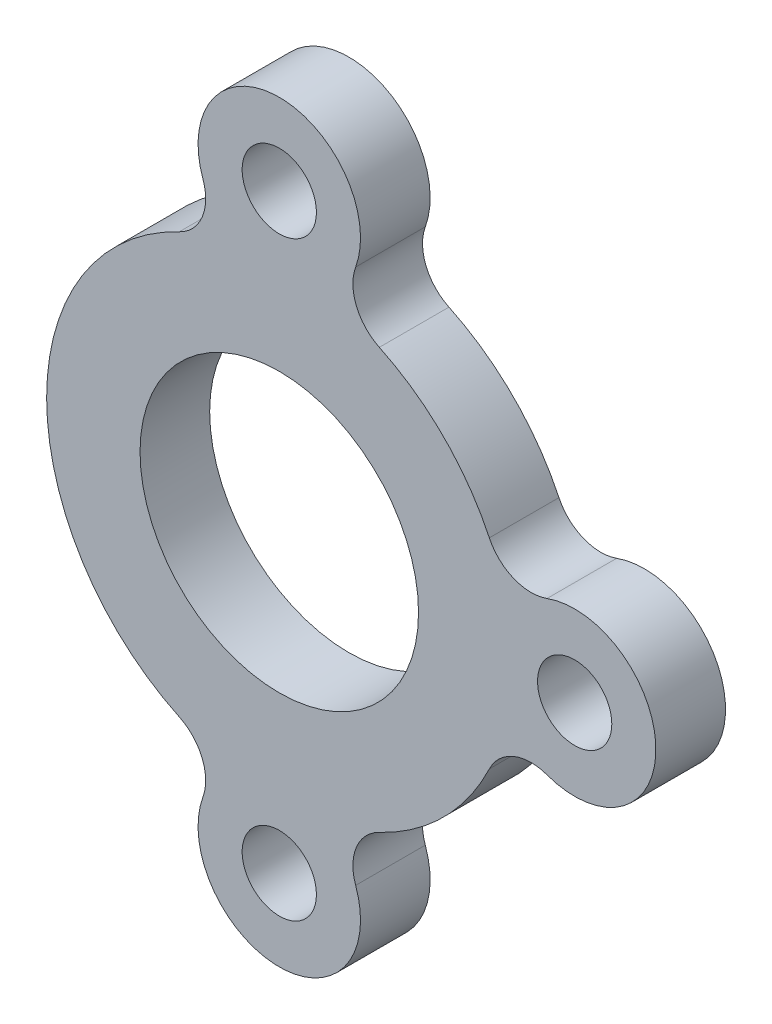
ISO-10303-21;
HEADER;
FILE_DESCRIPTION(('STEP AP214'),'2;1');
FILE_NAME('part.step','',(''),(''),'','','');
FILE_SCHEMA(('AUTOMOTIVE_DESIGN { 1 0 10303 214 1 1 1 1 }'));
ENDSEC;
DATA;
#1=APPLICATION_CONTEXT('core data for automotive mechanical design processes');
#2=APPLICATION_PROTOCOL_DEFINITION('international standard','automotive_design',2000,#1);
#3=PRODUCT_CONTEXT('',#1,'mechanical');
#4=PRODUCT('Part','Part','',(#3));
#5=PRODUCT_RELATED_PRODUCT_CATEGORY('part','',(#4));
#6=PRODUCT_DEFINITION_FORMATION('','',#4);
#7=PRODUCT_DEFINITION_CONTEXT('part definition',#1,'design');
#8=PRODUCT_DEFINITION('design','',#6,#7);
#9=PRODUCT_DEFINITION_SHAPE('','',#8);
#10=(LENGTH_UNIT() NAMED_UNIT(*) SI_UNIT(.MILLI.,.METRE.));
#11=(NAMED_UNIT(*) PLANE_ANGLE_UNIT() SI_UNIT($,.RADIAN.));
#12=(NAMED_UNIT(*) SI_UNIT($,.STERADIAN.) SOLID_ANGLE_UNIT());
#13=UNCERTAINTY_MEASURE_WITH_UNIT(LENGTH_MEASURE(1.E-05),#10,'distance_accuracy_value','');
#14=(GEOMETRIC_REPRESENTATION_CONTEXT(3) GLOBAL_UNCERTAINTY_ASSIGNED_CONTEXT((#13)) GLOBAL_UNIT_ASSIGNED_CONTEXT((#10,
#11,#12)) REPRESENTATION_CONTEXT('',''));
#15=CARTESIAN_POINT('',(0.,0.,0.));
#16=DIRECTION('',(0.,0.,1.));
#17=DIRECTION('',(1.,0.,0.));
#18=AXIS2_PLACEMENT_3D('',#15,#16,#17);
#19=CARTESIAN_POINT('',(11.6325384302734,-40.8646359623816,3.));
#20=DIRECTION('',(0.,0.,-1.));
#21=DIRECTION('',(-1.,0.,0.));
#22=AXIS2_PLACEMENT_3D('',#19,#20,#21);
#23=CYLINDRICAL_SURFACE('',#22,2.);
#24=CARTESIAN_POINT('',(11.6325384302734,-40.8646359623816,0.));
#25=DIRECTION('',(0.,0.,1.));
#26=DIRECTION('',(1.,0.,0.));
#27=AXIS2_PLACEMENT_3D('',#24,#25,#26);
#28=CIRCLE('',#27,2.);
#29=CARTESIAN_POINT('',(13.5131467078111,-41.545306592317,0.));
#30=VERTEX_POINT('',#29);
#31=CARTESIAN_POINT('',(12.4926919044071,-39.0590512922717,0.));
#32=VERTEX_POINT('',#31);
#33=EDGE_CURVE('E165',#30,#32,#28,.T.);
#34=ORIENTED_EDGE('',*,*,#33,.F.);
#35=DIRECTION('',(0.,0.,-1.));
#36=VECTOR('',#35,1.);
#37=CARTESIAN_POINT('',(13.5131467078111,-41.545306592317,3.));
#38=LINE('',#37,#36);
#39=CARTESIAN_POINT('',(13.5131467078111,-41.545306592317,3.));
#40=VERTEX_POINT('',#39);
#41=EDGE_CURVE('E11',#40,#30,#38,.T.);
#42=ORIENTED_EDGE('',*,*,#41,.F.);
#43=CARTESIAN_POINT('',(11.6325384302734,-40.8646359623816,3.));
#44=DIRECTION('',(0.,0.,1.));
#45=DIRECTION('',(1.,0.,0.));
#46=AXIS2_PLACEMENT_3D('',#43,#44,#45);
#47=CIRCLE('',#46,2.);
#48=CARTESIAN_POINT('',(12.4926919044071,-39.0590512922717,3.));
#49=VERTEX_POINT('',#48);
#50=EDGE_CURVE('E203',#40,#49,#47,.T.);
#51=ORIENTED_EDGE('',*,*,#50,.T.);
#52=DIRECTION('',(0.,0.,-1.));
#53=VECTOR('',#52,1.);
#54=CARTESIAN_POINT('',(12.4926919044071,-39.0590512922717,3.));
#55=LINE('',#54,#53);
#56=EDGE_CURVE('E96',#49,#32,#55,.T.);
#57=ORIENTED_EDGE('',*,*,#56,.T.);
#58=EDGE_LOOP('',(#34,#42,#51,#57));
#59=FACE_BOUND('',#58,.T.);
#60=ADVANCED_FACE('F34',(#59),#23,.F.);
#61=CARTESIAN_POINT('',(16.8042111935021,-42.7364801947039,3.));
#62=DIRECTION('',(0.,0.,-1.));
#63=DIRECTION('',(-1.,0.,0.));
#64=AXIS2_PLACEMENT_3D('',#61,#62,#63);
#65=CYLINDRICAL_SURFACE('',#64,3.49999999999999);
#66=CARTESIAN_POINT('',(16.8042111935021,-42.7364801947039,0.));
#67=DIRECTION('',(0.,0.,1.));
#68=DIRECTION('',(1.,0.,0.));
#69=AXIS2_PLACEMENT_3D('',#66,#67,#68);
#70=CIRCLE('',#69,3.49999999999999);
#71=CARTESIAN_POINT('',(20.0952756791932,-41.545306592317,0.));
#72=VERTEX_POINT('',#71);
#73=EDGE_CURVE('E168',#30,#72,#70,.T.);
#74=ORIENTED_EDGE('',*,*,#73,.T.);
#75=DIRECTION('',(0.,0.,-1.));
#76=VECTOR('',#75,1.);
#77=CARTESIAN_POINT('',(20.0952756791932,-41.545306592317,3.));
#78=LINE('',#77,#76);
#79=CARTESIAN_POINT('',(20.0952756791932,-41.545306592317,3.));
#80=VERTEX_POINT('',#79);
#81=EDGE_CURVE('E42',#80,#72,#78,.T.);
#82=ORIENTED_EDGE('',*,*,#81,.F.);
#83=CARTESIAN_POINT('',(16.8042111935021,-42.7364801947039,3.));
#84=DIRECTION('',(0.,0.,1.));
#85=DIRECTION('',(1.,0.,0.));
#86=AXIS2_PLACEMENT_3D('',#83,#84,#85);
#87=CIRCLE('',#86,3.49999999999999);
#88=EDGE_CURVE('E249',#40,#80,#87,.T.);
#89=ORIENTED_EDGE('',*,*,#88,.F.);
#90=ORIENTED_EDGE('',*,*,#41,.T.);
#91=EDGE_LOOP('',(#74,#82,#89,#90));
#92=FACE_BOUND('',#91,.T.);
#93=ADVANCED_FACE('F269',(#92),#65,.T.);
#94=CARTESIAN_POINT('',(21.9758839567309,-40.8646359623817,3.));
#95=DIRECTION('',(0.,0.,-1.));
#96=DIRECTION('',(-1.,0.,0.));
#97=AXIS2_PLACEMENT_3D('',#94,#95,#96);
#98=CYLINDRICAL_SURFACE('',#97,2.);
#99=CARTESIAN_POINT('',(21.9758839567309,-40.8646359623817,0.));
#100=DIRECTION('',(0.,0.,1.));
#101=DIRECTION('',(1.,0.,0.));
#102=AXIS2_PLACEMENT_3D('',#99,#100,#101);
#103=CIRCLE('',#102,2.);
#104=CARTESIAN_POINT('',(21.1157304825972,-39.0590512922718,0.));
#105=VERTEX_POINT('',#104);
#106=EDGE_CURVE('E170',#72,#105,#103,.F.);
#107=ORIENTED_EDGE('',*,*,#106,.T.);
#108=DIRECTION('',(0.,0.,-1.));
#109=VECTOR('',#108,1.);
#110=CARTESIAN_POINT('',(21.1157304825972,-39.0590512922718,3.));
#111=LINE('',#110,#109);
#112=CARTESIAN_POINT('',(21.1157304825972,-39.0590512922718,3.));
#113=VERTEX_POINT('',#112);
#114=EDGE_CURVE('E220',#113,#105,#111,.T.);
#115=ORIENTED_EDGE('',*,*,#114,.F.);
#116=CARTESIAN_POINT('',(21.9758839567309,-40.8646359623817,3.));
#117=DIRECTION('',(0.,0.,1.));
#118=DIRECTION('',(1.,0.,0.));
#119=AXIS2_PLACEMENT_3D('',#116,#117,#118);
#120=CIRCLE('',#119,2.);
#121=EDGE_CURVE('E229',#80,#113,#120,.F.);
#122=ORIENTED_EDGE('',*,*,#121,.F.);
#123=ORIENTED_EDGE('',*,*,#81,.T.);
#124=EDGE_LOOP('',(#107,#115,#122,#123));
#125=FACE_BOUND('',#124,.T.);
#126=ADVANCED_FACE('F227',(#125),#98,.F.);
#127=CARTESIAN_POINT('',(16.8042111935022,-30.0085581333461,3.));
#128=DIRECTION('',(0.,0.,-1.));
#129=DIRECTION('',(-1.,0.,0.));
#130=AXIS2_PLACEMENT_3D('',#127,#128,#129);
#131=CYLINDRICAL_SURFACE('',#130,10.025);
#132=CARTESIAN_POINT('',(16.8042111935022,-30.0085581333461,0.));
#133=DIRECTION('',(0.,0.,1.));
#134=DIRECTION('',(1.,0.,0.));
#135=AXIS2_PLACEMENT_3D('',#132,#133,#134);
#136=CIRCLE('',#135,10.025);
#137=CARTESIAN_POINT('',(25.8547043524279,-34.3200774224412,0.));
#138=VERTEX_POINT('',#137);
#139=EDGE_CURVE('E172',#105,#138,#136,.T.);
#140=ORIENTED_EDGE('',*,*,#139,.T.);
#141=DIRECTION('',(0.,0.,-1.));
#142=VECTOR('',#141,1.);
#143=CARTESIAN_POINT('',(25.8547043524279,-34.3200774224412,3.));
#144=LINE('',#143,#142);
#145=CARTESIAN_POINT('',(25.8547043524279,-34.3200774224412,3.));
#146=VERTEX_POINT('',#145);
#147=EDGE_CURVE('E218',#146,#138,#144,.T.);
#148=ORIENTED_EDGE('',*,*,#147,.F.);
#149=CARTESIAN_POINT('',(16.8042111935022,-30.0085581333461,3.));
#150=DIRECTION('',(0.,0.,1.));
#151=DIRECTION('',(1.,0.,0.));
#152=AXIS2_PLACEMENT_3D('',#149,#150,#151);
#153=CIRCLE('',#152,10.025);
#154=EDGE_CURVE('E243',#113,#146,#153,.T.);
#155=ORIENTED_EDGE('',*,*,#154,.F.);
#156=ORIENTED_EDGE('',*,*,#114,.T.);
#157=EDGE_LOOP('',(#140,#148,#155,#156));
#158=FACE_BOUND('',#157,.T.);
#159=ADVANCED_FACE('F240',(#158),#131,.T.);
#160=CARTESIAN_POINT('',(27.6602890225378,-35.1802308965748,3.));
#161=DIRECTION('',(0.,0.,-1.));
#162=DIRECTION('',(-1.,0.,0.));
#163=AXIS2_PLACEMENT_3D('',#160,#161,#162);
#164=CYLINDRICAL_SURFACE('',#163,2.);
#165=CARTESIAN_POINT('',(27.6602890225378,-35.1802308965748,0.));
#166=DIRECTION('',(0.,0.,1.));
#167=DIRECTION('',(1.,0.,0.));
#168=AXIS2_PLACEMENT_3D('',#165,#166,#167);
#169=CIRCLE('',#168,2.);
#170=CARTESIAN_POINT('',(28.3409596524732,-33.2996226190371,0.));
#171=VERTEX_POINT('',#170);
#172=EDGE_CURVE('E175',#171,#138,#169,.T.);
#173=ORIENTED_EDGE('',*,*,#172,.F.);
#174=DIRECTION('',(0.,0.,-1.));
#175=VECTOR('',#174,1.);
#176=CARTESIAN_POINT('',(28.3409596524732,-33.2996226190371,3.));
#177=LINE('',#176,#175);
#178=CARTESIAN_POINT('',(28.3409596524732,-33.2996226190371,3.));
#179=VERTEX_POINT('',#178);
#180=EDGE_CURVE('E216',#179,#171,#177,.T.);
#181=ORIENTED_EDGE('',*,*,#180,.F.);
#182=CARTESIAN_POINT('',(27.6602890225378,-35.1802308965748,3.));
#183=DIRECTION('',(0.,0.,1.));
#184=DIRECTION('',(1.,0.,0.));
#185=AXIS2_PLACEMENT_3D('',#182,#183,#184);
#186=CIRCLE('',#185,2.);
#187=EDGE_CURVE('E245',#179,#146,#186,.T.);
#188=ORIENTED_EDGE('',*,*,#187,.T.);
#189=ORIENTED_EDGE('',*,*,#147,.T.);
#190=EDGE_LOOP('',(#173,#181,#188,#189));
#191=FACE_BOUND('',#190,.T.);
#192=ADVANCED_FACE('F279',(#191),#164,.F.);
#193=CARTESIAN_POINT('',(29.5321332548601,-30.0085581333461,3.));
#194=DIRECTION('',(0.,0.,-1.));
#195=DIRECTION('',(-1.,0.,0.));
#196=AXIS2_PLACEMENT_3D('',#193,#194,#195);
#197=CYLINDRICAL_SURFACE('',#196,3.5);
#198=CARTESIAN_POINT('',(29.5321332548601,-30.0085581333461,0.));
#199=DIRECTION('',(0.,0.,1.));
#200=DIRECTION('',(1.,0.,0.));
#201=AXIS2_PLACEMENT_3D('',#198,#199,#200);
#202=CIRCLE('',#201,3.5);
#203=CARTESIAN_POINT('',(28.3409596524732,-26.7174936476551,0.));
#204=VERTEX_POINT('',#203);
#205=EDGE_CURVE('E178',#171,#204,#202,.T.);
#206=ORIENTED_EDGE('',*,*,#205,.T.);
#207=DIRECTION('',(0.,0.,-1.));
#208=VECTOR('',#207,1.);
#209=CARTESIAN_POINT('',(28.3409596524732,-26.7174936476551,3.));
#210=LINE('',#209,#208);
#211=CARTESIAN_POINT('',(28.3409596524732,-26.7174936476551,3.));
#212=VERTEX_POINT('',#211);
#213=EDGE_CURVE('E213',#212,#204,#210,.T.);
#214=ORIENTED_EDGE('',*,*,#213,.F.);
#215=CARTESIAN_POINT('',(29.5321332548601,-30.0085581333461,3.));
#216=DIRECTION('',(0.,0.,1.));
#217=DIRECTION('',(1.,0.,0.));
#218=AXIS2_PLACEMENT_3D('',#215,#216,#217);
#219=CIRCLE('',#218,3.5);
#220=EDGE_CURVE('E247',#179,#212,#219,.T.);
#221=ORIENTED_EDGE('',*,*,#220,.F.);
#222=ORIENTED_EDGE('',*,*,#180,.T.);
#223=EDGE_LOOP('',(#206,#214,#221,#222));
#224=FACE_BOUND('',#223,.T.);
#225=ADVANCED_FACE('F282',(#224),#197,.T.);
#226=CARTESIAN_POINT('',(27.6602890225379,-24.8368853701174,3.));
#227=DIRECTION('',(0.,0.,-1.));
#228=DIRECTION('',(-1.,0.,0.));
#229=AXIS2_PLACEMENT_3D('',#226,#227,#228);
#230=CYLINDRICAL_SURFACE('',#229,2.);
#231=CARTESIAN_POINT('',(27.6602890225379,-24.8368853701174,0.));
#232=DIRECTION('',(0.,0.,1.));
#233=DIRECTION('',(1.,0.,0.));
#234=AXIS2_PLACEMENT_3D('',#231,#232,#233);
#235=CIRCLE('',#234,2.);
#236=CARTESIAN_POINT('',(25.854704352428,-25.6970388442511,0.));
#237=VERTEX_POINT('',#236);
#238=EDGE_CURVE('E180',#204,#237,#235,.F.);
#239=ORIENTED_EDGE('',*,*,#238,.T.);
#240=DIRECTION('',(0.,0.,-1.));
#241=VECTOR('',#240,1.);
#242=CARTESIAN_POINT('',(25.854704352428,-25.6970388442511,3.));
#243=LINE('',#242,#241);
#244=CARTESIAN_POINT('',(25.854704352428,-25.6970388442511,3.));
#245=VERTEX_POINT('',#244);
#246=EDGE_CURVE('E210',#245,#237,#243,.T.);
#247=ORIENTED_EDGE('',*,*,#246,.F.);
#248=CARTESIAN_POINT('',(27.6602890225379,-24.8368853701174,3.));
#249=DIRECTION('',(0.,0.,1.));
#250=DIRECTION('',(1.,0.,0.));
#251=AXIS2_PLACEMENT_3D('',#248,#249,#250);
#252=CIRCLE('',#251,2.);
#253=EDGE_CURVE('E254',#212,#245,#252,.F.);
#254=ORIENTED_EDGE('',*,*,#253,.F.);
#255=ORIENTED_EDGE('',*,*,#213,.T.);
#256=EDGE_LOOP('',(#239,#247,#254,#255));
#257=FACE_BOUND('',#256,.T.);
#258=ADVANCED_FACE('F286',(#257),#230,.F.);
#259=CARTESIAN_POINT('',(16.8042111935022,-30.0085581333461,3.));
#260=DIRECTION('',(0.,0.,-1.));
#261=DIRECTION('',(-1.,0.,0.));
#262=AXIS2_PLACEMENT_3D('',#259,#260,#261);
#263=CYLINDRICAL_SURFACE('',#262,10.025);
#264=CARTESIAN_POINT('',(16.8042111935022,-30.0085581333461,0.));
#265=DIRECTION('',(0.,0.,1.));
#266=DIRECTION('',(1.,0.,0.));
#267=AXIS2_PLACEMENT_3D('',#264,#265,#266);
#268=CIRCLE('',#267,10.025);
#269=CARTESIAN_POINT('',(21.1157304825974,-20.9580649744204,0.));
#270=VERTEX_POINT('',#269);
#271=EDGE_CURVE('E182',#237,#270,#268,.T.);
#272=ORIENTED_EDGE('',*,*,#271,.T.);
#273=DIRECTION('',(0.,0.,-1.));
#274=VECTOR('',#273,1.);
#275=CARTESIAN_POINT('',(21.1157304825974,-20.9580649744204,3.));
#276=LINE('',#275,#274);
#277=CARTESIAN_POINT('',(21.1157304825974,-20.9580649744204,3.));
#278=VERTEX_POINT('',#277);
#279=EDGE_CURVE('E207',#278,#270,#276,.T.);
#280=ORIENTED_EDGE('',*,*,#279,.F.);
#281=CARTESIAN_POINT('',(16.8042111935022,-30.0085581333461,3.));
#282=DIRECTION('',(0.,0.,1.));
#283=DIRECTION('',(1.,0.,0.));
#284=AXIS2_PLACEMENT_3D('',#281,#282,#283);
#285=CIRCLE('',#284,10.025);
#286=EDGE_CURVE('E256',#245,#278,#285,.T.);
#287=ORIENTED_EDGE('',*,*,#286,.F.);
#288=ORIENTED_EDGE('',*,*,#246,.T.);
#289=EDGE_LOOP('',(#272,#280,#287,#288));
#290=FACE_BOUND('',#289,.T.);
#291=ADVANCED_FACE('F262',(#290),#263,.T.);
#292=CARTESIAN_POINT('',(21.9758839567311,-19.1524803043105,3.));
#293=DIRECTION('',(0.,0.,-1.));
#294=DIRECTION('',(-1.,0.,0.));
#295=AXIS2_PLACEMENT_3D('',#292,#293,#294);
#296=CYLINDRICAL_SURFACE('',#295,2.);
#297=CARTESIAN_POINT('',(21.9758839567311,-19.1524803043105,0.));
#298=DIRECTION('',(0.,0.,1.));
#299=DIRECTION('',(1.,0.,0.));
#300=AXIS2_PLACEMENT_3D('',#297,#298,#299);
#301=CIRCLE('',#300,2.);
#302=CARTESIAN_POINT('',(20.0952756791934,-18.4718096743751,0.));
#303=VERTEX_POINT('',#302);
#304=EDGE_CURVE('E184',#270,#303,#301,.F.);
#305=ORIENTED_EDGE('',*,*,#304,.T.);
#306=DIRECTION('',(0.,0.,-1.));
#307=VECTOR('',#306,1.);
#308=CARTESIAN_POINT('',(20.0952756791934,-18.4718096743751,3.));
#309=LINE('',#308,#307);
#310=CARTESIAN_POINT('',(20.0952756791934,-18.4718096743751,3.));
#311=VERTEX_POINT('',#310);
#312=EDGE_CURVE('E146',#311,#303,#309,.T.);
#313=ORIENTED_EDGE('',*,*,#312,.F.);
#314=CARTESIAN_POINT('',(21.9758839567311,-19.1524803043105,3.));
#315=DIRECTION('',(0.,0.,1.));
#316=DIRECTION('',(1.,0.,0.));
#317=AXIS2_PLACEMENT_3D('',#314,#315,#316);
#318=CIRCLE('',#317,2.);
#319=EDGE_CURVE('E133',#278,#311,#318,.F.);
#320=ORIENTED_EDGE('',*,*,#319,.F.);
#321=ORIENTED_EDGE('',*,*,#279,.T.);
#322=EDGE_LOOP('',(#305,#313,#320,#321));
#323=FACE_BOUND('',#322,.T.);
#324=ADVANCED_FACE('F266',(#323),#296,.F.);
#325=CARTESIAN_POINT('',(16.8042111935024,-17.2806360719882,3.));
#326=DIRECTION('',(0.,0.,-1.));
#327=DIRECTION('',(-1.,0.,0.));
#328=AXIS2_PLACEMENT_3D('',#325,#326,#327);
#329=CYLINDRICAL_SURFACE('',#328,3.5);
#330=CARTESIAN_POINT('',(16.8042111935024,-17.2806360719882,0.));
#331=DIRECTION('',(0.,0.,1.));
#332=DIRECTION('',(1.,0.,0.));
#333=AXIS2_PLACEMENT_3D('',#330,#331,#332);
#334=CIRCLE('',#333,3.5);
#335=CARTESIAN_POINT('',(13.5131467078113,-18.4718096743751,0.));
#336=VERTEX_POINT('',#335);
#337=EDGE_CURVE('E142',#303,#336,#334,.T.);
#338=ORIENTED_EDGE('',*,*,#337,.T.);
#339=DIRECTION('',(0.,0.,-1.));
#340=VECTOR('',#339,1.);
#341=CARTESIAN_POINT('',(13.5131467078113,-18.4718096743751,3.));
#342=LINE('',#341,#340);
#343=CARTESIAN_POINT('',(13.5131467078113,-18.4718096743751,3.));
#344=VERTEX_POINT('',#343);
#345=EDGE_CURVE('E139',#344,#336,#342,.T.);
#346=ORIENTED_EDGE('',*,*,#345,.F.);
#347=CARTESIAN_POINT('',(16.8042111935024,-17.2806360719882,3.));
#348=DIRECTION('',(0.,0.,1.));
#349=DIRECTION('',(1.,0.,0.));
#350=AXIS2_PLACEMENT_3D('',#347,#348,#349);
#351=CIRCLE('',#350,3.5);
#352=EDGE_CURVE('E126',#311,#344,#351,.T.);
#353=ORIENTED_EDGE('',*,*,#352,.F.);
#354=ORIENTED_EDGE('',*,*,#312,.T.);
#355=EDGE_LOOP('',(#338,#346,#353,#354));
#356=FACE_BOUND('',#355,.T.);
#357=ADVANCED_FACE('F140',(#356),#329,.T.);
#358=CARTESIAN_POINT('',(11.6325384302736,-19.1524803043104,3.));
#359=DIRECTION('',(0.,0.,-1.));
#360=DIRECTION('',(-1.,0.,0.));
#361=AXIS2_PLACEMENT_3D('',#358,#359,#360);
#362=CYLINDRICAL_SURFACE('',#361,2.);
#363=CARTESIAN_POINT('',(11.6325384302736,-19.1524803043104,0.));
#364=DIRECTION('',(0.,0.,1.));
#365=DIRECTION('',(1.,0.,0.));
#366=AXIS2_PLACEMENT_3D('',#363,#364,#365);
#367=CIRCLE('',#366,2.);
#368=CARTESIAN_POINT('',(12.4926919044073,-20.9580649744203,0.));
#369=VERTEX_POINT('',#368);
#370=EDGE_CURVE('E187',#369,#336,#367,.T.);
#371=ORIENTED_EDGE('',*,*,#370,.F.);
#372=DIRECTION('',(0.,0.,-1.));
#373=VECTOR('',#372,1.);
#374=CARTESIAN_POINT('',(12.4926919044073,-20.9580649744203,3.));
#375=LINE('',#374,#373);
#376=CARTESIAN_POINT('',(12.4926919044073,-20.9580649744203,3.));
#377=VERTEX_POINT('',#376);
#378=EDGE_CURVE('E89',#377,#369,#375,.T.);
#379=ORIENTED_EDGE('',*,*,#378,.F.);
#380=CARTESIAN_POINT('',(11.6325384302736,-19.1524803043104,3.));
#381=DIRECTION('',(0.,0.,1.));
#382=DIRECTION('',(1.,0.,0.));
#383=AXIS2_PLACEMENT_3D('',#380,#381,#382);
#384=CIRCLE('',#383,2.);
#385=EDGE_CURVE('E131',#377,#344,#384,.T.);
#386=ORIENTED_EDGE('',*,*,#385,.T.);
#387=ORIENTED_EDGE('',*,*,#345,.T.);
#388=EDGE_LOOP('',(#371,#379,#386,#387));
#389=FACE_BOUND('',#388,.T.);
#390=ADVANCED_FACE('F148',(#389),#362,.F.);
#391=CARTESIAN_POINT('',(16.8042111935022,-30.0085581333461,3.));
#392=DIRECTION('',(0.,0.,-1.));
#393=DIRECTION('',(-1.,0.,0.));
#394=AXIS2_PLACEMENT_3D('',#391,#392,#393);
#395=CYLINDRICAL_SURFACE('',#394,5.99999999999815);
#396=CARTESIAN_POINT('',(16.8042111935022,-30.0085581333461,3.));
#397=DIRECTION('',(0.,0.,1.));
#398=DIRECTION('',(1.,0.,0.));
#399=AXIS2_PLACEMENT_3D('',#396,#397,#398);
#400=CIRCLE('',#399,5.99999999999815);
#401=CARTESIAN_POINT('',(22.8042111935004,-30.0085581333461,3.));
#402=VERTEX_POINT('',#401);
#403=EDGE_CURVE('E159',#402,#402,#400,.T.);
#404=ORIENTED_EDGE('',*,*,#403,.T.);
#405=EDGE_LOOP('',(#404));
#406=FACE_BOUND('',#405,.T.);
#407=CARTESIAN_POINT('',(16.8042111935022,-30.0085581333461,0.));
#408=DIRECTION('',(0.,0.,1.));
#409=DIRECTION('',(1.,0.,0.));
#410=AXIS2_PLACEMENT_3D('',#407,#408,#409);
#411=CIRCLE('',#410,5.99999999999815);
#412=CARTESIAN_POINT('',(22.8042111935004,-30.0085581333461,0.));
#413=VERTEX_POINT('',#412);
#414=EDGE_CURVE('E197',#413,#413,#411,.T.);
#415=ORIENTED_EDGE('',*,*,#414,.F.);
#416=EDGE_LOOP('',(#415));
#417=FACE_BOUND('',#416,.T.);
#418=ADVANCED_FACE('F299',(#406,#417),#395,.F.);
#419=CARTESIAN_POINT('',(16.8042111935021,-42.7364801947039,3.));
#420=DIRECTION('',(0.,0.,-1.));
#421=DIRECTION('',(-1.,0.,0.));
#422=AXIS2_PLACEMENT_3D('',#419,#420,#421);
#423=CYLINDRICAL_SURFACE('',#422,1.59999999999809);
#424=CARTESIAN_POINT('',(16.8042111935021,-42.7364801947039,3.));
#425=DIRECTION('',(0.,0.,1.));
#426=DIRECTION('',(1.,0.,0.));
#427=AXIS2_PLACEMENT_3D('',#424,#425,#426);
#428=CIRCLE('',#427,1.59999999999809);
#429=CARTESIAN_POINT('',(18.4042111935002,-42.7364801947039,3.));
#430=VERTEX_POINT('',#429);
#431=EDGE_CURVE('E156',#430,#430,#428,.T.);
#432=ORIENTED_EDGE('',*,*,#431,.T.);
#433=EDGE_LOOP('',(#432));
#434=FACE_BOUND('',#433,.T.);
#435=CARTESIAN_POINT('',(16.8042111935021,-42.7364801947039,0.));
#436=DIRECTION('',(0.,0.,1.));
#437=DIRECTION('',(1.,0.,0.));
#438=AXIS2_PLACEMENT_3D('',#435,#436,#437);
#439=CIRCLE('',#438,1.59999999999809);
#440=CARTESIAN_POINT('',(18.4042111935002,-42.7364801947039,0.));
#441=VERTEX_POINT('',#440);
#442=EDGE_CURVE('E194',#441,#441,#439,.T.);
#443=ORIENTED_EDGE('',*,*,#442,.F.);
#444=EDGE_LOOP('',(#443));
#445=FACE_BOUND('',#444,.T.);
#446=ADVANCED_FACE('F306',(#434,#445),#423,.F.);
#447=CARTESIAN_POINT('',(29.5321332548601,-30.0085581333461,3.));
#448=DIRECTION('',(0.,0.,-1.));
#449=DIRECTION('',(-1.,0.,0.));
#450=AXIS2_PLACEMENT_3D('',#447,#448,#449);
#451=CYLINDRICAL_SURFACE('',#450,1.59999999999813);
#452=CARTESIAN_POINT('',(29.5321332548601,-30.0085581333461,3.));
#453=DIRECTION('',(0.,0.,1.));
#454=DIRECTION('',(1.,0.,0.));
#455=AXIS2_PLACEMENT_3D('',#452,#453,#454);
#456=CIRCLE('',#455,1.59999999999813);
#457=CARTESIAN_POINT('',(31.1321332548583,-30.0085581333461,3.));
#458=VERTEX_POINT('',#457);
#459=EDGE_CURVE('E150',#458,#458,#456,.T.);
#460=ORIENTED_EDGE('',*,*,#459,.T.);
#461=EDGE_LOOP('',(#460));
#462=FACE_BOUND('',#461,.T.);
#463=CARTESIAN_POINT('',(29.5321332548601,-30.0085581333461,0.));
#464=DIRECTION('',(0.,0.,1.));
#465=DIRECTION('',(1.,0.,0.));
#466=AXIS2_PLACEMENT_3D('',#463,#464,#465);
#467=CIRCLE('',#466,1.59999999999813);
#468=CARTESIAN_POINT('',(31.1321332548583,-30.0085581333461,0.));
#469=VERTEX_POINT('',#468);
#470=EDGE_CURVE('E191',#469,#469,#467,.T.);
#471=ORIENTED_EDGE('',*,*,#470,.F.);
#472=EDGE_LOOP('',(#471));
#473=FACE_BOUND('',#472,.T.);
#474=ADVANCED_FACE('F303',(#462,#473),#451,.F.);
#475=CARTESIAN_POINT('',(16.8042111935022,-30.0085581333461,3.));
#476=DIRECTION('',(0.,0.,-1.));
#477=DIRECTION('',(-1.,0.,0.));
#478=AXIS2_PLACEMENT_3D('',#475,#476,#477);
#479=CYLINDRICAL_SURFACE('',#478,10.025);
#480=CARTESIAN_POINT('',(16.8042111935022,-30.0085581333461,0.));
#481=DIRECTION('',(0.,0.,1.));
#482=DIRECTION('',(1.,0.,0.));
#483=AXIS2_PLACEMENT_3D('',#480,#481,#482);
#484=CIRCLE('',#483,10.025);
#485=EDGE_CURVE('E189',#369,#32,#484,.T.);
#486=ORIENTED_EDGE('',*,*,#485,.T.);
#487=ORIENTED_EDGE('',*,*,#56,.F.);
#488=CARTESIAN_POINT('',(16.8042111935022,-30.0085581333461,3.));
#489=DIRECTION('',(0.,0.,1.));
#490=DIRECTION('',(1.,0.,0.));
#491=AXIS2_PLACEMENT_3D('',#488,#489,#490);
#492=CIRCLE('',#491,10.025);
#493=EDGE_CURVE('E50',#377,#49,#492,.T.);
#494=ORIENTED_EDGE('',*,*,#493,.F.);
#495=ORIENTED_EDGE('',*,*,#378,.T.);
#496=EDGE_LOOP('',(#486,#487,#494,#495));
#497=FACE_BOUND('',#496,.T.);
#498=ADVANCED_FACE('F267',(#497),#479,.T.);
#499=CARTESIAN_POINT('',(16.8042111935024,-17.2806360719882,3.));
#500=DIRECTION('',(0.,0.,-1.));
#501=DIRECTION('',(-1.,0.,0.));
#502=AXIS2_PLACEMENT_3D('',#499,#500,#501);
#503=CYLINDRICAL_SURFACE('',#502,1.59999999999813);
#504=CARTESIAN_POINT('',(16.8042111935024,-17.2806360719882,3.));
#505=DIRECTION('',(0.,0.,1.));
#506=DIRECTION('',(1.,0.,0.));
#507=AXIS2_PLACEMENT_3D('',#504,#505,#506);
#508=CIRCLE('',#507,1.59999999999813);
#509=CARTESIAN_POINT('',(18.4042111935005,-17.2806360719882,3.));
#510=VERTEX_POINT('',#509);
#511=EDGE_CURVE('E162',#510,#510,#508,.T.);
#512=ORIENTED_EDGE('',*,*,#511,.T.);
#513=EDGE_LOOP('',(#512));
#514=FACE_BOUND('',#513,.T.);
#515=CARTESIAN_POINT('',(16.8042111935024,-17.2806360719882,0.));
#516=DIRECTION('',(0.,0.,1.));
#517=DIRECTION('',(1.,0.,0.));
#518=AXIS2_PLACEMENT_3D('',#515,#516,#517);
#519=CIRCLE('',#518,1.59999999999813);
#520=CARTESIAN_POINT('',(18.4042111935005,-17.2806360719882,0.));
#521=VERTEX_POINT('',#520);
#522=EDGE_CURVE('E200',#521,#521,#519,.T.);
#523=ORIENTED_EDGE('',*,*,#522,.F.);
#524=EDGE_LOOP('',(#523));
#525=FACE_BOUND('',#524,.T.);
#526=ADVANCED_FACE('F302',(#514,#525),#503,.F.);
#527=CARTESIAN_POINT('',(0.,0.,3.));
#528=DIRECTION('',(0.,0.,1.));
#529=DIRECTION('',(1.,0.,0.));
#530=AXIS2_PLACEMENT_3D('',#527,#528,#529);
#531=PLANE('',#530);
#532=ORIENTED_EDGE('',*,*,#50,.F.);
#533=ORIENTED_EDGE('',*,*,#88,.T.);
#534=ORIENTED_EDGE('',*,*,#121,.T.);
#535=ORIENTED_EDGE('',*,*,#154,.T.);
#536=ORIENTED_EDGE('',*,*,#187,.F.);
#537=ORIENTED_EDGE('',*,*,#220,.T.);
#538=ORIENTED_EDGE('',*,*,#253,.T.);
#539=ORIENTED_EDGE('',*,*,#286,.T.);
#540=ORIENTED_EDGE('',*,*,#319,.T.);
#541=ORIENTED_EDGE('',*,*,#352,.T.);
#542=ORIENTED_EDGE('',*,*,#385,.F.);
#543=ORIENTED_EDGE('',*,*,#493,.T.);
#544=EDGE_LOOP('',(#532,#533,#534,#535,#536,#537,#538,#539,#540,#541,#542,#543));
#545=FACE_BOUND('',#544,.T.);
#546=ORIENTED_EDGE('',*,*,#459,.F.);
#547=EDGE_LOOP('',(#546));
#548=FACE_BOUND('',#547,.T.);
#549=ORIENTED_EDGE('',*,*,#431,.F.);
#550=EDGE_LOOP('',(#549));
#551=FACE_BOUND('',#550,.T.);
#552=ORIENTED_EDGE('',*,*,#403,.F.);
#553=EDGE_LOOP('',(#552));
#554=FACE_BOUND('',#553,.T.);
#555=ORIENTED_EDGE('',*,*,#511,.F.);
#556=EDGE_LOOP('',(#555));
#557=FACE_BOUND('',#556,.T.);
#558=ADVANCED_FACE('F128',(#545,#548,#551,#554,#557),#531,.T.);
#559=CARTESIAN_POINT('',(0.,0.,0.));
#560=DIRECTION('',(0.,0.,1.));
#561=DIRECTION('',(1.,0.,0.));
#562=AXIS2_PLACEMENT_3D('',#559,#560,#561);
#563=PLANE('',#562);
#564=ORIENTED_EDGE('',*,*,#33,.T.);
#565=ORIENTED_EDGE('',*,*,#485,.F.);
#566=ORIENTED_EDGE('',*,*,#370,.T.);
#567=ORIENTED_EDGE('',*,*,#337,.F.);
#568=ORIENTED_EDGE('',*,*,#304,.F.);
#569=ORIENTED_EDGE('',*,*,#271,.F.);
#570=ORIENTED_EDGE('',*,*,#238,.F.);
#571=ORIENTED_EDGE('',*,*,#205,.F.);
#572=ORIENTED_EDGE('',*,*,#172,.T.);
#573=ORIENTED_EDGE('',*,*,#139,.F.);
#574=ORIENTED_EDGE('',*,*,#106,.F.);
#575=ORIENTED_EDGE('',*,*,#73,.F.);
#576=EDGE_LOOP('',(#564,#565,#566,#567,#568,#569,#570,#571,#572,#573,#574,#575));
#577=FACE_BOUND('',#576,.T.);
#578=ORIENTED_EDGE('',*,*,#470,.T.);
#579=EDGE_LOOP('',(#578));
#580=FACE_BOUND('',#579,.T.);
#581=ORIENTED_EDGE('',*,*,#442,.T.);
#582=EDGE_LOOP('',(#581));
#583=FACE_BOUND('',#582,.T.);
#584=ORIENTED_EDGE('',*,*,#414,.T.);
#585=EDGE_LOOP('',(#584));
#586=FACE_BOUND('',#585,.T.);
#587=ORIENTED_EDGE('',*,*,#522,.T.);
#588=EDGE_LOOP('',(#587));
#589=FACE_BOUND('',#588,.T.);
#590=ADVANCED_FACE('F234',(#577,#580,#583,#586,#589),#563,.F.);
#591=CLOSED_SHELL('',(#60,#93,#126,#159,#192,#225,#258,#291,#324,#357,#390,#418,#446,#474,#498,
#526,#558,#590));
#592=MANIFOLD_SOLID_BREP('B2',#591);
#593=ADVANCED_BREP_SHAPE_REPRESENTATION('',(#18,#592),#14);
#594=SHAPE_DEFINITION_REPRESENTATION(#9,#593);
ENDSEC;
END-ISO-10303-21;
